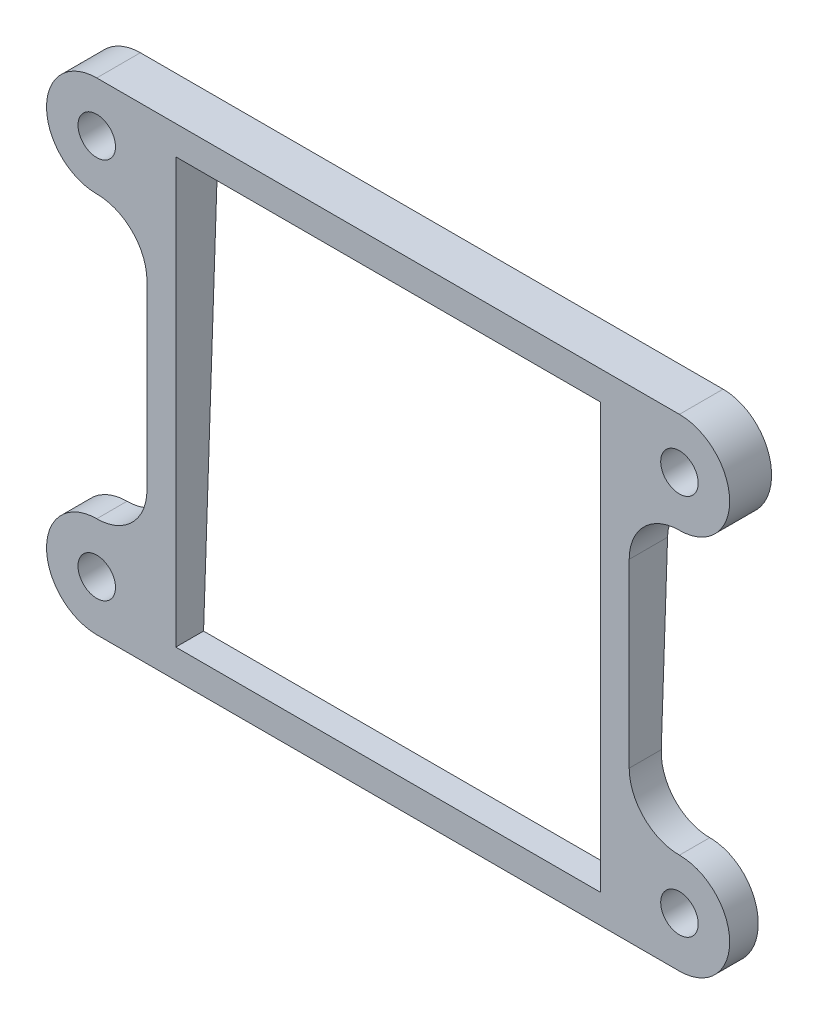
ISO-10303-21;
HEADER;
FILE_DESCRIPTION(('STEP AP214'),'2;1');
FILE_NAME('part.step','',(''),(''),'','','');
FILE_SCHEMA(('AUTOMOTIVE_DESIGN { 1 0 10303 214 1 1 1 1 }'));
ENDSEC;
DATA;
#1=APPLICATION_CONTEXT('core data for automotive mechanical design processes');
#2=APPLICATION_PROTOCOL_DEFINITION('international standard','automotive_design',2000,#1);
#3=PRODUCT_CONTEXT('',#1,'mechanical');
#4=PRODUCT('Part','Part','',(#3));
#5=PRODUCT_RELATED_PRODUCT_CATEGORY('part','',(#4));
#6=PRODUCT_DEFINITION_FORMATION('','',#4);
#7=PRODUCT_DEFINITION_CONTEXT('part definition',#1,'design');
#8=PRODUCT_DEFINITION('design','',#6,#7);
#9=PRODUCT_DEFINITION_SHAPE('','',#8);
#10=(LENGTH_UNIT() NAMED_UNIT(*) SI_UNIT(.MILLI.,.METRE.));
#11=(NAMED_UNIT(*) PLANE_ANGLE_UNIT() SI_UNIT($,.RADIAN.));
#12=(NAMED_UNIT(*) SI_UNIT($,.STERADIAN.) SOLID_ANGLE_UNIT());
#13=UNCERTAINTY_MEASURE_WITH_UNIT(LENGTH_MEASURE(1.E-05),#10,'distance_accuracy_value','');
#14=(GEOMETRIC_REPRESENTATION_CONTEXT(3) GLOBAL_UNCERTAINTY_ASSIGNED_CONTEXT((#13)) GLOBAL_UNIT_ASSIGNED_CONTEXT((#10,
#11,#12)) REPRESENTATION_CONTEXT('',''));
#15=CARTESIAN_POINT('',(0.,0.,0.));
#16=DIRECTION('',(0.,0.,1.));
#17=DIRECTION('',(1.,0.,0.));
#18=AXIS2_PLACEMENT_3D('',#15,#16,#17);
#19=CARTESIAN_POINT('',(76.2,45.72,-3.19315516232476));
#20=DIRECTION('',(0.,0.0348994967024938,0.999390827019096));
#21=DIRECTION('',(0.,-0.999390827019096,0.0348994967024938));
#22=AXIS2_PLACEMENT_3D('',#19,#20,#21);
#23=PLANE('',#22);
#24=CARTESIAN_POINT('',(55.245,36.195,-2.86053483291593));
#25=DIRECTION('',(0.,0.0348994967024938,0.999390827019096));
#26=DIRECTION('',(0.,-0.999390827019096,0.0348994967024938));
#27=AXIS2_PLACEMENT_3D('',#24,#25,#26);
#28=ELLIPSE('',#27,3.55816753952662,3.55600000000001);
#29=CARTESIAN_POINT('',(55.245,32.639,-2.7363565766033));
#30=VERTEX_POINT('',#29);
#31=EDGE_CURVE('E277',#30,#30,#28,.T.);
#32=ORIENTED_EDGE('',*,*,#31,.T.);
#33=EDGE_LOOP('',(#32));
#34=FACE_BOUND('',#33,.T.);
#35=CARTESIAN_POINT('',(55.245,-36.195,-0.332620329408829));
#36=DIRECTION('',(0.,0.0348994967024938,0.999390827019096));
#37=DIRECTION('',(0.,-0.999390827019096,0.0348994967024938));
#38=AXIS2_PLACEMENT_3D('',#35,#36,#37);
#39=ELLIPSE('',#38,3.55816753952662,3.55600000000001);
#40=CARTESIAN_POINT('',(55.245,-39.751,-0.208442073096199));
#41=VERTEX_POINT('',#40);
#42=EDGE_CURVE('E331',#41,#41,#39,.T.);
#43=ORIENTED_EDGE('',*,*,#42,.T.);
#44=EDGE_LOOP('',(#43));
#45=FACE_BOUND('',#44,.T.);
#46=CARTESIAN_POINT('',(-55.245,-36.195,-0.332620329408829));
#47=DIRECTION('',(0.,0.0348994967024938,0.999390827019096));
#48=DIRECTION('',(0.,-0.999390827019096,0.0348994967024938));
#49=AXIS2_PLACEMENT_3D('',#46,#47,#48);
#50=ELLIPSE('',#49,3.55816753952662,3.55600000000001);
#51=CARTESIAN_POINT('',(-55.245,-39.751,-0.208442073096199));
#52=VERTEX_POINT('',#51);
#53=EDGE_CURVE('E328',#52,#52,#50,.T.);
#54=ORIENTED_EDGE('',*,*,#53,.T.);
#55=EDGE_LOOP('',(#54));
#56=FACE_BOUND('',#55,.T.);
#57=CARTESIAN_POINT('',(-55.245,36.195,-2.86053483291593));
#58=DIRECTION('',(0.,0.0348994967024938,0.999390827019096));
#59=DIRECTION('',(0.,-0.999390827019096,0.0348994967024938));
#60=AXIS2_PLACEMENT_3D('',#57,#58,#59);
#61=ELLIPSE('',#60,3.55816753952662,3.55600000000001);
#62=CARTESIAN_POINT('',(-55.245,32.639,-2.7363565766033));
#63=VERTEX_POINT('',#62);
#64=EDGE_CURVE('E272',#63,#63,#61,.T.);
#65=ORIENTED_EDGE('',*,*,#64,.T.);
#66=EDGE_LOOP('',(#65));
#67=FACE_BOUND('',#66,.T.);
#68=CARTESIAN_POINT('',(55.245,-17.145,-0.997860988226486));
#69=DIRECTION('',(0.,0.0348994967024938,0.999390827019096));
#70=DIRECTION('',(0.,-0.999390827019096,0.0348994967024938));
#71=AXIS2_PLACEMENT_3D('',#68,#69,#70);
#72=ELLIPSE('',#71,9.53080590944628,9.525);
#73=CARTESIAN_POINT('',(45.72,-17.145,-0.997860988226486));
#74=VERTEX_POINT('',#73);
#75=CARTESIAN_POINT('',(55.245,-26.67,-0.665240658817657));
#76=VERTEX_POINT('',#75);
#77=EDGE_CURVE('E267',#74,#76,#72,.T.);
#78=ORIENTED_EDGE('',*,*,#77,.T.);
#79=CARTESIAN_POINT('',(55.245,-36.195,-0.332620329408829));
#80=DIRECTION('',(0.,0.0348994967024938,0.999390827019096));
#81=DIRECTION('',(0.,-0.999390827019096,0.0348994967024938));
#82=AXIS2_PLACEMENT_3D('',#79,#80,#81);
#83=ELLIPSE('',#82,9.53080590944628,9.525);
#84=CARTESIAN_POINT('',(55.245,-45.72,0.));
#85=VERTEX_POINT('',#84);
#86=EDGE_CURVE('E270',#76,#85,#83,.F.);
#87=ORIENTED_EDGE('',*,*,#86,.T.);
#88=DIRECTION('',(-1.,0.,0.));
#89=VECTOR('',#88,1.);
#90=CARTESIAN_POINT('',(45.72,-45.72,0.));
#91=LINE('',#90,#89);
#92=CARTESIAN_POINT('',(-55.245,-45.72,0.));
#93=VERTEX_POINT('',#92);
#94=EDGE_CURVE('E278',#85,#93,#91,.T.);
#95=ORIENTED_EDGE('',*,*,#94,.T.);
#96=CARTESIAN_POINT('',(-55.245,-36.195,-0.332620329408829));
#97=DIRECTION('',(0.,0.0348994967024938,0.999390827019096));
#98=DIRECTION('',(0.,-0.999390827019096,0.0348994967024938));
#99=AXIS2_PLACEMENT_3D('',#96,#97,#98);
#100=ELLIPSE('',#99,9.53080590944628,9.525);
#101=CARTESIAN_POINT('',(-55.245,-26.67,-0.665240658817657));
#102=VERTEX_POINT('',#101);
#103=EDGE_CURVE('E243',#93,#102,#100,.F.);
#104=ORIENTED_EDGE('',*,*,#103,.T.);
#105=CARTESIAN_POINT('',(-55.245,-17.145,-0.997860988226486));
#106=DIRECTION('',(0.,0.0348994967024938,0.999390827019096));
#107=DIRECTION('',(0.,-0.999390827019096,0.0348994967024938));
#108=AXIS2_PLACEMENT_3D('',#105,#106,#107);
#109=ELLIPSE('',#108,9.53080590944628,9.525);
#110=CARTESIAN_POINT('',(-45.72,-17.145,-0.997860988226486));
#111=VERTEX_POINT('',#110);
#112=EDGE_CURVE('E246',#102,#111,#109,.T.);
#113=ORIENTED_EDGE('',*,*,#112,.T.);
#114=DIRECTION('',(0.,0.999390827019096,-0.0348994967024938));
#115=VECTOR('',#114,1.);
#116=CARTESIAN_POINT('',(-45.72,45.72,-3.19315516232476));
#117=LINE('',#116,#115);
#118=CARTESIAN_POINT('',(-45.72,17.145,-2.19529417409827));
#119=VERTEX_POINT('',#118);
#120=EDGE_CURVE('E249',#111,#119,#117,.T.);
#121=ORIENTED_EDGE('',*,*,#120,.T.);
#122=CARTESIAN_POINT('',(-55.245,17.145,-2.19529417409827));
#123=DIRECTION('',(0.,0.0348994967024938,0.999390827019096));
#124=DIRECTION('',(0.,-0.999390827019096,0.0348994967024938));
#125=AXIS2_PLACEMENT_3D('',#122,#123,#124);
#126=ELLIPSE('',#125,9.53080590944628,9.525);
#127=CARTESIAN_POINT('',(-55.245,26.67,-2.5279145035071));
#128=VERTEX_POINT('',#127);
#129=EDGE_CURVE('E252',#119,#128,#126,.T.);
#130=ORIENTED_EDGE('',*,*,#129,.T.);
#131=CARTESIAN_POINT('',(-55.245,36.195,-2.86053483291593));
#132=DIRECTION('',(0.,0.0348994967024938,0.999390827019096));
#133=DIRECTION('',(0.,-0.999390827019096,0.0348994967024938));
#134=AXIS2_PLACEMENT_3D('',#131,#132,#133);
#135=ELLIPSE('',#134,9.53080590944627,9.525);
#136=CARTESIAN_POINT('',(-55.245,45.72,-3.19315516232476));
#137=VERTEX_POINT('',#136);
#138=EDGE_CURVE('E255',#128,#137,#135,.F.);
#139=ORIENTED_EDGE('',*,*,#138,.T.);
#140=DIRECTION('',(-1.,0.,0.));
#141=VECTOR('',#140,1.);
#142=CARTESIAN_POINT('',(76.2,45.72,-3.19315516232476));
#143=LINE('',#142,#141);
#144=CARTESIAN_POINT('',(55.245,45.72,-3.19315516232476));
#145=VERTEX_POINT('',#144);
#146=EDGE_CURVE('E273',#145,#137,#143,.T.);
#147=ORIENTED_EDGE('',*,*,#146,.F.);
#148=CARTESIAN_POINT('',(55.245,36.195,-2.86053483291593));
#149=DIRECTION('',(0.,0.0348994967024938,0.999390827019096));
#150=DIRECTION('',(0.,-0.999390827019096,0.0348994967024938));
#151=AXIS2_PLACEMENT_3D('',#148,#149,#150);
#152=ELLIPSE('',#151,9.53080590944628,9.525);
#153=CARTESIAN_POINT('',(55.245,26.67,-2.5279145035071));
#154=VERTEX_POINT('',#153);
#155=EDGE_CURVE('E258',#145,#154,#152,.F.);
#156=ORIENTED_EDGE('',*,*,#155,.T.);
#157=CARTESIAN_POINT('',(55.245,17.145,-2.19529417409827));
#158=DIRECTION('',(0.,0.0348994967024938,0.999390827019096));
#159=DIRECTION('',(0.,-0.999390827019096,0.0348994967024938));
#160=AXIS2_PLACEMENT_3D('',#157,#158,#159);
#161=ELLIPSE('',#160,9.53080590944628,9.525);
#162=CARTESIAN_POINT('',(45.72,17.145,-2.19529417409827));
#163=VERTEX_POINT('',#162);
#164=EDGE_CURVE('E261',#154,#163,#161,.T.);
#165=ORIENTED_EDGE('',*,*,#164,.T.);
#166=DIRECTION('',(0.,-0.999390827019096,0.0348994967024938));
#167=VECTOR('',#166,1.);
#168=CARTESIAN_POINT('',(45.72,45.72,-3.19315516232476));
#169=LINE('',#168,#167);
#170=EDGE_CURVE('E264',#163,#74,#169,.T.);
#171=ORIENTED_EDGE('',*,*,#170,.T.);
#172=EDGE_LOOP('',(#78,#87,#95,#104,#113,#121,#130,#139,#147,#156,#165,#171));
#173=FACE_BOUND('',#172,.T.);
#174=DIRECTION('',(0.,-0.999390827019096,0.0348994967024938));
#175=VECTOR('',#174,1.);
#176=CARTESIAN_POINT('',(-40.259,45.72,-3.19315516232476));
#177=LINE('',#176,#175);
#178=CARTESIAN_POINT('',(-40.259,40.259,-3.00245284013036));
#179=VERTEX_POINT('',#178);
#180=CARTESIAN_POINT('',(-40.259,-40.259,-0.190702322194394));
#181=VERTEX_POINT('',#180);
#182=EDGE_CURVE('E321',#179,#181,#177,.T.);
#183=ORIENTED_EDGE('',*,*,#182,.T.);
#184=DIRECTION('',(1.,0.,0.));
#185=VECTOR('',#184,1.);
#186=CARTESIAN_POINT('',(76.2,-40.259,-0.190702322194395));
#187=LINE('',#186,#185);
#188=CARTESIAN_POINT('',(40.259,-40.259,-0.190702322194395));
#189=VERTEX_POINT('',#188);
#190=EDGE_CURVE('E190',#181,#189,#187,.T.);
#191=ORIENTED_EDGE('',*,*,#190,.T.);
#192=DIRECTION('',(0.,0.999390827019096,-0.0348994967024938));
#193=VECTOR('',#192,1.);
#194=CARTESIAN_POINT('',(40.259,45.72,-3.19315516232476));
#195=LINE('',#194,#193);
#196=CARTESIAN_POINT('',(40.259,40.259,-3.00245284013036));
#197=VERTEX_POINT('',#196);
#198=EDGE_CURVE('E40',#189,#197,#195,.T.);
#199=ORIENTED_EDGE('',*,*,#198,.T.);
#200=DIRECTION('',(-1.,0.,0.));
#201=VECTOR('',#200,1.);
#202=CARTESIAN_POINT('',(76.2,40.259,-3.00245284013036));
#203=LINE('',#202,#201);
#204=EDGE_CURVE('E310',#197,#179,#203,.T.);
#205=ORIENTED_EDGE('',*,*,#204,.T.);
#206=EDGE_LOOP('',(#183,#191,#199,#205));
#207=FACE_BOUND('',#206,.T.);
#208=ADVANCED_FACE('F32',(#34,#45,#56,#67,#173,#207),#23,.F.);
#209=CARTESIAN_POINT('',(-76.2,-45.72,5.08));
#210=DIRECTION('',(0.,0.,-1.));
#211=DIRECTION('',(-1.,0.,0.));
#212=AXIS2_PLACEMENT_3D('',#209,#210,#211);
#213=PLANE('',#212);
#214=CARTESIAN_POINT('',(-55.245,36.195,5.08));
#215=DIRECTION('',(0.,0.,-1.));
#216=DIRECTION('',(-1.,0.,0.));
#217=AXIS2_PLACEMENT_3D('',#214,#215,#216);
#218=CIRCLE('',#217,3.55600000000001);
#219=CARTESIAN_POINT('',(-58.801,36.195,5.08));
#220=VERTEX_POINT('',#219);
#221=EDGE_CURVE('E235',#220,#220,#218,.F.);
#222=ORIENTED_EDGE('',*,*,#221,.F.);
#223=EDGE_LOOP('',(#222));
#224=FACE_BOUND('',#223,.T.);
#225=CARTESIAN_POINT('',(-55.245,36.195,5.08));
#226=DIRECTION('',(0.,0.,-1.));
#227=DIRECTION('',(-1.,0.,0.));
#228=AXIS2_PLACEMENT_3D('',#225,#226,#227);
#229=CIRCLE('',#228,9.525);
#230=CARTESIAN_POINT('',(-55.245,45.72,5.08));
#231=VERTEX_POINT('',#230);
#232=CARTESIAN_POINT('',(-64.77,36.195,5.08));
#233=VERTEX_POINT('',#232);
#234=EDGE_CURVE('E234',#231,#233,#229,.F.);
#235=ORIENTED_EDGE('',*,*,#234,.T.);
#236=CARTESIAN_POINT('',(-55.245,26.67,5.08));
#237=VERTEX_POINT('',#236);
#238=EDGE_CURVE('E232',#233,#237,#229,.F.);
#239=ORIENTED_EDGE('',*,*,#238,.T.);
#240=CARTESIAN_POINT('',(-55.245,17.145,5.08));
#241=DIRECTION('',(0.,0.,-1.));
#242=DIRECTION('',(-1.,0.,0.));
#243=AXIS2_PLACEMENT_3D('',#240,#241,#242);
#244=CIRCLE('',#243,9.525);
#245=CARTESIAN_POINT('',(-45.72,17.145,5.08));
#246=VERTEX_POINT('',#245);
#247=EDGE_CURVE('E229',#246,#237,#244,.F.);
#248=ORIENTED_EDGE('',*,*,#247,.F.);
#249=DIRECTION('',(0.,-1.,0.));
#250=VECTOR('',#249,1.);
#251=CARTESIAN_POINT('',(-45.72,-45.72,5.08));
#252=LINE('',#251,#250);
#253=CARTESIAN_POINT('',(-45.72,-17.145,5.08));
#254=VERTEX_POINT('',#253);
#255=EDGE_CURVE('E227',#246,#254,#252,.T.);
#256=ORIENTED_EDGE('',*,*,#255,.T.);
#257=CARTESIAN_POINT('',(-55.245,-17.145,5.08));
#258=DIRECTION('',(0.,0.,-1.));
#259=DIRECTION('',(-1.,0.,0.));
#260=AXIS2_PLACEMENT_3D('',#257,#258,#259);
#261=CIRCLE('',#260,9.525);
#262=CARTESIAN_POINT('',(-55.245,-26.67,5.08));
#263=VERTEX_POINT('',#262);
#264=EDGE_CURVE('E221',#263,#254,#261,.F.);
#265=ORIENTED_EDGE('',*,*,#264,.F.);
#266=CARTESIAN_POINT('',(-55.245,-36.195,5.08));
#267=DIRECTION('',(0.,0.,-1.));
#268=DIRECTION('',(-1.,0.,0.));
#269=AXIS2_PLACEMENT_3D('',#266,#267,#268);
#270=CIRCLE('',#269,9.525);
#271=CARTESIAN_POINT('',(-64.77,-36.195,5.08));
#272=VERTEX_POINT('',#271);
#273=EDGE_CURVE('E224',#263,#272,#270,.F.);
#274=ORIENTED_EDGE('',*,*,#273,.T.);
#275=CARTESIAN_POINT('',(-55.245,-45.72,5.08));
#276=VERTEX_POINT('',#275);
#277=EDGE_CURVE('E226',#272,#276,#270,.F.);
#278=ORIENTED_EDGE('',*,*,#277,.T.);
#279=DIRECTION('',(1.,0.,0.));
#280=VECTOR('',#279,1.);
#281=CARTESIAN_POINT('',(-76.2,-45.72,5.08));
#282=LINE('',#281,#280);
#283=CARTESIAN_POINT('',(55.2449999999999,-45.72,5.08));
#284=VERTEX_POINT('',#283);
#285=EDGE_CURVE('E200',#276,#284,#282,.T.);
#286=ORIENTED_EDGE('',*,*,#285,.T.);
#287=CARTESIAN_POINT('',(55.245,-36.195,5.08));
#288=DIRECTION('',(0.,0.,-1.));
#289=DIRECTION('',(-1.,0.,0.));
#290=AXIS2_PLACEMENT_3D('',#287,#288,#289);
#291=CIRCLE('',#290,9.525);
#292=CARTESIAN_POINT('',(64.77,-36.195,5.08));
#293=VERTEX_POINT('',#292);
#294=EDGE_CURVE('E214',#284,#293,#291,.F.);
#295=ORIENTED_EDGE('',*,*,#294,.T.);
#296=CARTESIAN_POINT('',(55.245,-26.67,5.08));
#297=VERTEX_POINT('',#296);
#298=EDGE_CURVE('E212',#293,#297,#291,.F.);
#299=ORIENTED_EDGE('',*,*,#298,.T.);
#300=CARTESIAN_POINT('',(55.245,-17.145,5.08));
#301=DIRECTION('',(0.,0.,-1.));
#302=DIRECTION('',(-1.,0.,0.));
#303=AXIS2_PLACEMENT_3D('',#300,#301,#302);
#304=CIRCLE('',#303,9.525);
#305=CARTESIAN_POINT('',(45.72,-17.145,5.08));
#306=VERTEX_POINT('',#305);
#307=EDGE_CURVE('E209',#306,#297,#304,.F.);
#308=ORIENTED_EDGE('',*,*,#307,.F.);
#309=DIRECTION('',(0.,1.,0.));
#310=VECTOR('',#309,1.);
#311=CARTESIAN_POINT('',(45.72,45.72,5.08));
#312=LINE('',#311,#310);
#313=CARTESIAN_POINT('',(45.72,17.145,5.08));
#314=VERTEX_POINT('',#313);
#315=EDGE_CURVE('E47',#306,#314,#312,.T.);
#316=ORIENTED_EDGE('',*,*,#315,.T.);
#317=CARTESIAN_POINT('',(55.245,17.145,5.08));
#318=DIRECTION('',(0.,0.,-1.));
#319=DIRECTION('',(-1.,0.,0.));
#320=AXIS2_PLACEMENT_3D('',#317,#318,#319);
#321=CIRCLE('',#320,9.525);
#322=CARTESIAN_POINT('',(55.245,26.67,5.08));
#323=VERTEX_POINT('',#322);
#324=EDGE_CURVE('E11',#323,#314,#321,.F.);
#325=ORIENTED_EDGE('',*,*,#324,.F.);
#326=CARTESIAN_POINT('',(55.245,36.195,5.08));
#327=DIRECTION('',(0.,0.,-1.));
#328=DIRECTION('',(-1.,0.,0.));
#329=AXIS2_PLACEMENT_3D('',#326,#327,#328);
#330=CIRCLE('',#329,9.525);
#331=CARTESIAN_POINT('',(64.77,36.195,5.08));
#332=VERTEX_POINT('',#331);
#333=EDGE_CURVE('E204',#323,#332,#330,.F.);
#334=ORIENTED_EDGE('',*,*,#333,.T.);
#335=CARTESIAN_POINT('',(55.245,45.72,5.08));
#336=VERTEX_POINT('',#335);
#337=EDGE_CURVE('E207',#332,#336,#330,.F.);
#338=ORIENTED_EDGE('',*,*,#337,.T.);
#339=DIRECTION('',(1.,0.,0.));
#340=VECTOR('',#339,1.);
#341=CARTESIAN_POINT('',(-76.2,45.72,5.08));
#342=LINE('',#341,#340);
#343=EDGE_CURVE('E201',#231,#336,#342,.T.);
#344=ORIENTED_EDGE('',*,*,#343,.F.);
#345=EDGE_LOOP('',(#235,#239,#248,#256,#265,#274,#278,#286,#295,#299,#308,#316,#325,#334,#338,#344));
#346=FACE_BOUND('',#345,.T.);
#347=CARTESIAN_POINT('',(55.245,-36.195,5.08));
#348=DIRECTION('',(0.,0.,-1.));
#349=DIRECTION('',(-1.,0.,0.));
#350=AXIS2_PLACEMENT_3D('',#347,#348,#349);
#351=CIRCLE('',#350,3.55600000000001);
#352=CARTESIAN_POINT('',(51.689,-36.195,5.08));
#353=VERTEX_POINT('',#352);
#354=EDGE_CURVE('E218',#353,#353,#351,.T.);
#355=ORIENTED_EDGE('',*,*,#354,.T.);
#356=EDGE_LOOP('',(#355));
#357=FACE_BOUND('',#356,.T.);
#358=CARTESIAN_POINT('',(55.245,36.195,5.08));
#359=DIRECTION('',(0.,0.,-1.));
#360=DIRECTION('',(-1.,0.,0.));
#361=AXIS2_PLACEMENT_3D('',#358,#359,#360);
#362=CIRCLE('',#361,3.55600000000001);
#363=CARTESIAN_POINT('',(51.689,36.195,5.08));
#364=VERTEX_POINT('',#363);
#365=EDGE_CURVE('E215',#364,#364,#362,.T.);
#366=ORIENTED_EDGE('',*,*,#365,.T.);
#367=EDGE_LOOP('',(#366));
#368=FACE_BOUND('',#367,.T.);
#369=CARTESIAN_POINT('',(-55.245,-36.195,5.08));
#370=DIRECTION('',(0.,0.,-1.));
#371=DIRECTION('',(-1.,0.,0.));
#372=AXIS2_PLACEMENT_3D('',#369,#370,#371);
#373=CIRCLE('',#372,3.55600000000001);
#374=CARTESIAN_POINT('',(-58.801,-36.195,5.08));
#375=VERTEX_POINT('',#374);
#376=EDGE_CURVE('E186',#375,#375,#373,.F.);
#377=ORIENTED_EDGE('',*,*,#376,.F.);
#378=EDGE_LOOP('',(#377));
#379=FACE_BOUND('',#378,.T.);
#380=DIRECTION('',(1.,0.,0.));
#381=VECTOR('',#380,1.);
#382=CARTESIAN_POINT('',(40.259,-40.259,5.08));
#383=LINE('',#382,#381);
#384=CARTESIAN_POINT('',(-40.259,-40.259,5.08));
#385=VERTEX_POINT('',#384);
#386=CARTESIAN_POINT('',(40.259,-40.259,5.08));
#387=VERTEX_POINT('',#386);
#388=EDGE_CURVE('E167',#385,#387,#383,.T.);
#389=ORIENTED_EDGE('',*,*,#388,.F.);
#390=DIRECTION('',(0.,-1.,0.));
#391=VECTOR('',#390,1.);
#392=CARTESIAN_POINT('',(-40.259,-40.259,5.08));
#393=LINE('',#392,#391);
#394=CARTESIAN_POINT('',(-40.259,40.259,5.08));
#395=VERTEX_POINT('',#394);
#396=EDGE_CURVE('E170',#395,#385,#393,.T.);
#397=ORIENTED_EDGE('',*,*,#396,.F.);
#398=DIRECTION('',(-1.,0.,0.));
#399=VECTOR('',#398,1.);
#400=CARTESIAN_POINT('',(-40.259,40.259,5.08));
#401=LINE('',#400,#399);
#402=CARTESIAN_POINT('',(40.259,40.259,5.08));
#403=VERTEX_POINT('',#402);
#404=EDGE_CURVE('E241',#403,#395,#401,.T.);
#405=ORIENTED_EDGE('',*,*,#404,.F.);
#406=DIRECTION('',(0.,1.,0.));
#407=VECTOR('',#406,1.);
#408=CARTESIAN_POINT('',(40.259,40.259,5.08));
#409=LINE('',#408,#407);
#410=EDGE_CURVE('E173',#387,#403,#409,.T.);
#411=ORIENTED_EDGE('',*,*,#410,.F.);
#412=EDGE_LOOP('',(#389,#397,#405,#411));
#413=FACE_BOUND('',#412,.T.);
#414=ADVANCED_FACE('F169',(#224,#346,#357,#368,#379,#413),#213,.F.);
#415=CARTESIAN_POINT('',(-45.72,45.72,40.64));
#416=DIRECTION('',(0.,1.,0.));
#417=DIRECTION('',(0.,0.,1.));
#418=AXIS2_PLACEMENT_3D('',#415,#416,#417);
#419=PLANE('',#418);
#420=ORIENTED_EDGE('',*,*,#343,.T.);
#421=DIRECTION('',(0.,0.,-1.));
#422=VECTOR('',#421,1.);
#423=CARTESIAN_POINT('',(55.245,45.72,0.));
#424=LINE('',#423,#422);
#425=EDGE_CURVE('E308',#336,#145,#424,.T.);
#426=ORIENTED_EDGE('',*,*,#425,.T.);
#427=ORIENTED_EDGE('',*,*,#146,.T.);
#428=DIRECTION('',(0.,0.,-1.));
#429=VECTOR('',#428,1.);
#430=CARTESIAN_POINT('',(-55.245,45.72,40.64));
#431=LINE('',#430,#429);
#432=EDGE_CURVE('E289',#137,#231,#431,.F.);
#433=ORIENTED_EDGE('',*,*,#432,.T.);
#434=EDGE_LOOP('',(#420,#426,#427,#433));
#435=FACE_BOUND('',#434,.T.);
#436=ADVANCED_FACE('F360',(#435),#419,.T.);
#437=CARTESIAN_POINT('',(-45.72,-45.72,40.64));
#438=DIRECTION('',(-1.,0.,0.));
#439=DIRECTION('',(0.,0.,1.));
#440=AXIS2_PLACEMENT_3D('',#437,#438,#439);
#441=PLANE('',#440);
#442=ORIENTED_EDGE('',*,*,#255,.F.);
#443=DIRECTION('',(0.,0.,-1.));
#444=VECTOR('',#443,1.);
#445=CARTESIAN_POINT('',(-45.72,17.145,0.));
#446=LINE('',#445,#444);
#447=EDGE_CURVE('E285',#246,#119,#446,.T.);
#448=ORIENTED_EDGE('',*,*,#447,.T.);
#449=ORIENTED_EDGE('',*,*,#120,.F.);
#450=DIRECTION('',(0.,0.,-1.));
#451=VECTOR('',#450,1.);
#452=CARTESIAN_POINT('',(-45.72,-17.145,6.35));
#453=LINE('',#452,#451);
#454=EDGE_CURVE('E281',#111,#254,#453,.F.);
#455=ORIENTED_EDGE('',*,*,#454,.T.);
#456=EDGE_LOOP('',(#442,#448,#449,#455));
#457=FACE_BOUND('',#456,.T.);
#458=ADVANCED_FACE('F366',(#457),#441,.T.);
#459=CARTESIAN_POINT('',(45.72,-45.72,40.64));
#460=DIRECTION('',(0.,-1.,0.));
#461=DIRECTION('',(0.,0.,-1.));
#462=AXIS2_PLACEMENT_3D('',#459,#460,#461);
#463=PLANE('',#462);
#464=ORIENTED_EDGE('',*,*,#285,.F.);
#465=DIRECTION('',(0.,0.,-1.));
#466=VECTOR('',#465,1.);
#467=CARTESIAN_POINT('',(-55.245,-45.72,40.64));
#468=LINE('',#467,#466);
#469=EDGE_CURVE('E287',#276,#93,#468,.T.);
#470=ORIENTED_EDGE('',*,*,#469,.T.);
#471=ORIENTED_EDGE('',*,*,#94,.F.);
#472=DIRECTION('',(0.,0.,-1.));
#473=VECTOR('',#472,1.);
#474=CARTESIAN_POINT('',(55.245,-45.72,6.35));
#475=LINE('',#474,#473);
#476=EDGE_CURVE('E305',#85,#284,#475,.F.);
#477=ORIENTED_EDGE('',*,*,#476,.T.);
#478=EDGE_LOOP('',(#464,#470,#471,#477));
#479=FACE_BOUND('',#478,.T.);
#480=ADVANCED_FACE('F408',(#479),#463,.T.);
#481=CARTESIAN_POINT('',(45.72,45.72,40.64));
#482=DIRECTION('',(1.,0.,0.));
#483=DIRECTION('',(0.,0.,-1.));
#484=AXIS2_PLACEMENT_3D('',#481,#482,#483);
#485=PLANE('',#484);
#486=ORIENTED_EDGE('',*,*,#315,.F.);
#487=DIRECTION('',(0.,0.,-1.));
#488=VECTOR('',#487,1.);
#489=CARTESIAN_POINT('',(45.72,-17.145,40.64));
#490=LINE('',#489,#488);
#491=EDGE_CURVE('E303',#306,#74,#490,.T.);
#492=ORIENTED_EDGE('',*,*,#491,.T.);
#493=ORIENTED_EDGE('',*,*,#170,.F.);
#494=DIRECTION('',(0.,0.,-1.));
#495=VECTOR('',#494,1.);
#496=CARTESIAN_POINT('',(45.72,17.145,40.64));
#497=LINE('',#496,#495);
#498=EDGE_CURVE('E292',#163,#314,#497,.F.);
#499=ORIENTED_EDGE('',*,*,#498,.T.);
#500=EDGE_LOOP('',(#486,#492,#493,#499));
#501=FACE_BOUND('',#500,.T.);
#502=ADVANCED_FACE('F402',(#501),#485,.T.);
#503=CARTESIAN_POINT('',(-40.259,40.259,-101.042647615157));
#504=DIRECTION('',(0.,1.,0.));
#505=DIRECTION('',(0.,0.,1.));
#506=AXIS2_PLACEMENT_3D('',#503,#504,#505);
#507=PLANE('',#506);
#508=ORIENTED_EDGE('',*,*,#204,.F.);
#509=DIRECTION('',(0.,0.,1.));
#510=VECTOR('',#509,1.);
#511=CARTESIAN_POINT('',(40.259,40.259,-3.19315516232475));
#512=LINE('',#511,#510);
#513=EDGE_CURVE('E197',#197,#403,#512,.T.);
#514=ORIENTED_EDGE('',*,*,#513,.T.);
#515=ORIENTED_EDGE('',*,*,#404,.T.);
#516=DIRECTION('',(0.,0.,1.));
#517=VECTOR('',#516,1.);
#518=CARTESIAN_POINT('',(-40.259,40.259,-3.19315516232475));
#519=LINE('',#518,#517);
#520=EDGE_CURVE('E185',#179,#395,#519,.T.);
#521=ORIENTED_EDGE('',*,*,#520,.F.);
#522=EDGE_LOOP('',(#508,#514,#515,#521));
#523=FACE_BOUND('',#522,.T.);
#524=ADVANCED_FACE('F392',(#523),#507,.F.);
#525=CARTESIAN_POINT('',(40.259,40.259,-101.042647615157));
#526=DIRECTION('',(1.,0.,0.));
#527=DIRECTION('',(0.,0.,-1.));
#528=AXIS2_PLACEMENT_3D('',#525,#526,#527);
#529=PLANE('',#528);
#530=ORIENTED_EDGE('',*,*,#198,.F.);
#531=DIRECTION('',(0.,0.,1.));
#532=VECTOR('',#531,1.);
#533=CARTESIAN_POINT('',(40.259,-40.259,-3.19315516232475));
#534=LINE('',#533,#532);
#535=EDGE_CURVE('E192',#189,#387,#534,.T.);
#536=ORIENTED_EDGE('',*,*,#535,.T.);
#537=ORIENTED_EDGE('',*,*,#410,.T.);
#538=ORIENTED_EDGE('',*,*,#513,.F.);
#539=EDGE_LOOP('',(#530,#536,#537,#538));
#540=FACE_BOUND('',#539,.T.);
#541=ADVANCED_FACE('F394',(#540),#529,.F.);
#542=CARTESIAN_POINT('',(40.259,-40.259,-101.042647615157));
#543=DIRECTION('',(0.,-1.,0.));
#544=DIRECTION('',(0.,0.,-1.));
#545=AXIS2_PLACEMENT_3D('',#542,#543,#544);
#546=PLANE('',#545);
#547=ORIENTED_EDGE('',*,*,#190,.F.);
#548=DIRECTION('',(0.,0.,1.));
#549=VECTOR('',#548,1.);
#550=CARTESIAN_POINT('',(-40.259,-40.259,-3.19315516232475));
#551=LINE('',#550,#549);
#552=EDGE_CURVE('E183',#181,#385,#551,.T.);
#553=ORIENTED_EDGE('',*,*,#552,.T.);
#554=ORIENTED_EDGE('',*,*,#388,.T.);
#555=ORIENTED_EDGE('',*,*,#535,.F.);
#556=EDGE_LOOP('',(#547,#553,#554,#555));
#557=FACE_BOUND('',#556,.T.);
#558=ADVANCED_FACE('F188',(#557),#546,.F.);
#559=CARTESIAN_POINT('',(-40.259,-40.259,-101.042647615157));
#560=DIRECTION('',(-1.,0.,0.));
#561=DIRECTION('',(0.,0.,1.));
#562=AXIS2_PLACEMENT_3D('',#559,#560,#561);
#563=PLANE('',#562);
#564=ORIENTED_EDGE('',*,*,#182,.F.);
#565=ORIENTED_EDGE('',*,*,#520,.T.);
#566=ORIENTED_EDGE('',*,*,#396,.T.);
#567=ORIENTED_EDGE('',*,*,#552,.F.);
#568=EDGE_LOOP('',(#564,#565,#566,#567));
#569=FACE_BOUND('',#568,.T.);
#570=ADVANCED_FACE('F182',(#569),#563,.F.);
#571=CARTESIAN_POINT('',(-55.245,-36.195,6.35));
#572=DIRECTION('',(0.,0.,-1.));
#573=DIRECTION('',(-1.,0.,0.));
#574=AXIS2_PLACEMENT_3D('',#571,#572,#573);
#575=CYLINDRICAL_SURFACE('',#574,3.55600000000001);
#576=ORIENTED_EDGE('',*,*,#376,.T.);
#577=EDGE_LOOP('',(#576));
#578=FACE_BOUND('',#577,.T.);
#579=ORIENTED_EDGE('',*,*,#53,.F.);
#580=EDGE_LOOP('',(#579));
#581=FACE_BOUND('',#580,.T.);
#582=ADVANCED_FACE('F378',(#578,#581),#575,.F.);
#583=CARTESIAN_POINT('',(-55.245,36.195,6.35));
#584=DIRECTION('',(0.,0.,-1.));
#585=DIRECTION('',(-1.,0.,0.));
#586=AXIS2_PLACEMENT_3D('',#583,#584,#585);
#587=CYLINDRICAL_SURFACE('',#586,3.55600000000001);
#588=ORIENTED_EDGE('',*,*,#221,.T.);
#589=EDGE_LOOP('',(#588));
#590=FACE_BOUND('',#589,.T.);
#591=ORIENTED_EDGE('',*,*,#64,.F.);
#592=EDGE_LOOP('',(#591));
#593=FACE_BOUND('',#592,.T.);
#594=ADVANCED_FACE('F381',(#590,#593),#587,.F.);
#595=CARTESIAN_POINT('',(-55.245,36.195,6.35));
#596=DIRECTION('',(0.,0.,-1.));
#597=DIRECTION('',(-1.,0.,0.));
#598=AXIS2_PLACEMENT_3D('',#595,#596,#597);
#599=CYLINDRICAL_SURFACE('',#598,9.525);
#600=ORIENTED_EDGE('',*,*,#238,.F.);
#601=DIRECTION('',(0.,0.,-1.));
#602=VECTOR('',#601,1.);
#603=CARTESIAN_POINT('',(-64.77,36.195,6.35));
#604=LINE('',#603,#602);
#605=CARTESIAN_POINT('',(-64.77,36.195,0.));
#606=VERTEX_POINT('',#605);
#607=EDGE_CURVE('E282',#233,#606,#604,.T.);
#608=ORIENTED_EDGE('',*,*,#607,.T.);
#609=ORIENTED_EDGE('',*,*,#607,.F.);
#610=ORIENTED_EDGE('',*,*,#234,.F.);
#611=ORIENTED_EDGE('',*,*,#432,.F.);
#612=ORIENTED_EDGE('',*,*,#138,.F.);
#613=DIRECTION('',(0.,0.,-1.));
#614=VECTOR('',#613,1.);
#615=CARTESIAN_POINT('',(-55.245,26.67,6.35));
#616=LINE('',#615,#614);
#617=EDGE_CURVE('E293',#237,#128,#616,.T.);
#618=ORIENTED_EDGE('',*,*,#617,.F.);
#619=EDGE_LOOP('',(#600,#608,#609,#610,#611,#612,#618));
#620=FACE_BOUND('',#619,.T.);
#621=ADVANCED_FACE('F420',(#620),#599,.T.);
#622=CARTESIAN_POINT('',(-55.245,17.145,40.64));
#623=DIRECTION('',(0.,0.,1.));
#624=DIRECTION('',(1.,0.,0.));
#625=AXIS2_PLACEMENT_3D('',#622,#623,#624);
#626=CYLINDRICAL_SURFACE('',#625,9.525);
#627=ORIENTED_EDGE('',*,*,#447,.F.);
#628=ORIENTED_EDGE('',*,*,#247,.T.);
#629=ORIENTED_EDGE('',*,*,#617,.T.);
#630=ORIENTED_EDGE('',*,*,#129,.F.);
#631=EDGE_LOOP('',(#627,#628,#629,#630));
#632=FACE_BOUND('',#631,.T.);
#633=ADVANCED_FACE('F416',(#632),#626,.F.);
#634=CARTESIAN_POINT('',(-55.245,-36.195,40.64));
#635=DIRECTION('',(0.,0.,-1.));
#636=DIRECTION('',(-1.,0.,0.));
#637=AXIS2_PLACEMENT_3D('',#634,#635,#636);
#638=CYLINDRICAL_SURFACE('',#637,9.525);
#639=ORIENTED_EDGE('',*,*,#277,.F.);
#640=DIRECTION('',(0.,0.,-1.));
#641=VECTOR('',#640,1.);
#642=CARTESIAN_POINT('',(-64.77,-36.195,6.35));
#643=LINE('',#642,#641);
#644=CARTESIAN_POINT('',(-64.77,-36.195,0.));
#645=VERTEX_POINT('',#644);
#646=EDGE_CURVE('E53',#645,#272,#643,.F.);
#647=ORIENTED_EDGE('',*,*,#646,.F.);
#648=ORIENTED_EDGE('',*,*,#646,.T.);
#649=ORIENTED_EDGE('',*,*,#273,.F.);
#650=DIRECTION('',(0.,0.,-1.));
#651=VECTOR('',#650,1.);
#652=CARTESIAN_POINT('',(-55.245,-26.67,6.35));
#653=LINE('',#652,#651);
#654=EDGE_CURVE('E296',#102,#263,#653,.F.);
#655=ORIENTED_EDGE('',*,*,#654,.F.);
#656=ORIENTED_EDGE('',*,*,#103,.F.);
#657=ORIENTED_EDGE('',*,*,#469,.F.);
#658=EDGE_LOOP('',(#639,#647,#648,#649,#655,#656,#657));
#659=FACE_BOUND('',#658,.T.);
#660=ADVANCED_FACE('F419',(#659),#638,.T.);
#661=CARTESIAN_POINT('',(-55.245,-17.145,6.35));
#662=DIRECTION('',(0.,0.,1.));
#663=DIRECTION('',(1.,0.,0.));
#664=AXIS2_PLACEMENT_3D('',#661,#662,#663);
#665=CYLINDRICAL_SURFACE('',#664,9.525);
#666=ORIENTED_EDGE('',*,*,#654,.T.);
#667=ORIENTED_EDGE('',*,*,#264,.T.);
#668=ORIENTED_EDGE('',*,*,#454,.F.);
#669=ORIENTED_EDGE('',*,*,#112,.F.);
#670=EDGE_LOOP('',(#666,#667,#668,#669));
#671=FACE_BOUND('',#670,.T.);
#672=ADVANCED_FACE('F351',(#671),#665,.F.);
#673=CARTESIAN_POINT('',(55.245,-36.195,6.35));
#674=DIRECTION('',(0.,0.,-1.));
#675=DIRECTION('',(-1.,0.,0.));
#676=AXIS2_PLACEMENT_3D('',#673,#674,#675);
#677=CYLINDRICAL_SURFACE('',#676,3.55600000000001);
#678=ORIENTED_EDGE('',*,*,#354,.F.);
#679=EDGE_LOOP('',(#678));
#680=FACE_BOUND('',#679,.T.);
#681=ORIENTED_EDGE('',*,*,#42,.F.);
#682=EDGE_LOOP('',(#681));
#683=FACE_BOUND('',#682,.T.);
#684=ADVANCED_FACE('F341',(#680,#683),#677,.F.);
#685=CARTESIAN_POINT('',(55.245,36.195,6.35));
#686=DIRECTION('',(0.,0.,-1.));
#687=DIRECTION('',(-1.,0.,0.));
#688=AXIS2_PLACEMENT_3D('',#685,#686,#687);
#689=CYLINDRICAL_SURFACE('',#688,3.55600000000001);
#690=ORIENTED_EDGE('',*,*,#365,.F.);
#691=EDGE_LOOP('',(#690));
#692=FACE_BOUND('',#691,.T.);
#693=ORIENTED_EDGE('',*,*,#31,.F.);
#694=EDGE_LOOP('',(#693));
#695=FACE_BOUND('',#694,.T.);
#696=ADVANCED_FACE('F338',(#692,#695),#689,.F.);
#697=CARTESIAN_POINT('',(55.245,-36.195,6.35));
#698=DIRECTION('',(0.,0.,1.));
#699=DIRECTION('',(1.,0.,0.));
#700=AXIS2_PLACEMENT_3D('',#697,#698,#699);
#701=CYLINDRICAL_SURFACE('',#700,9.525);
#702=ORIENTED_EDGE('',*,*,#294,.F.);
#703=ORIENTED_EDGE('',*,*,#476,.F.);
#704=ORIENTED_EDGE('',*,*,#86,.F.);
#705=DIRECTION('',(0.,0.,-1.));
#706=VECTOR('',#705,1.);
#707=CARTESIAN_POINT('',(55.245,-26.67,6.35));
#708=LINE('',#707,#706);
#709=EDGE_CURVE('E311',#297,#76,#708,.T.);
#710=ORIENTED_EDGE('',*,*,#709,.F.);
#711=ORIENTED_EDGE('',*,*,#298,.F.);
#712=DIRECTION('',(0.,0.,-1.));
#713=VECTOR('',#712,1.);
#714=CARTESIAN_POINT('',(64.77,-36.195,0.));
#715=LINE('',#714,#713);
#716=CARTESIAN_POINT('',(64.77,-36.195,0.));
#717=VERTEX_POINT('',#716);
#718=EDGE_CURVE('E299',#293,#717,#715,.T.);
#719=ORIENTED_EDGE('',*,*,#718,.T.);
#720=ORIENTED_EDGE('',*,*,#718,.F.);
#721=EDGE_LOOP('',(#702,#703,#704,#710,#711,#719,#720));
#722=FACE_BOUND('',#721,.T.);
#723=ADVANCED_FACE('F340',(#722),#701,.T.);
#724=CARTESIAN_POINT('',(55.245,-17.145,40.64));
#725=DIRECTION('',(0.,0.,-1.));
#726=DIRECTION('',(-1.,0.,0.));
#727=AXIS2_PLACEMENT_3D('',#724,#725,#726);
#728=CYLINDRICAL_SURFACE('',#727,9.525);
#729=ORIENTED_EDGE('',*,*,#491,.F.);
#730=ORIENTED_EDGE('',*,*,#307,.T.);
#731=ORIENTED_EDGE('',*,*,#709,.T.);
#732=ORIENTED_EDGE('',*,*,#77,.F.);
#733=EDGE_LOOP('',(#729,#730,#731,#732));
#734=FACE_BOUND('',#733,.T.);
#735=ADVANCED_FACE('F348',(#734),#728,.F.);
#736=CARTESIAN_POINT('',(55.245,36.195,40.64));
#737=DIRECTION('',(0.,0.,1.));
#738=DIRECTION('',(1.,0.,0.));
#739=AXIS2_PLACEMENT_3D('',#736,#737,#738);
#740=CYLINDRICAL_SURFACE('',#739,9.525);
#741=ORIENTED_EDGE('',*,*,#333,.F.);
#742=DIRECTION('',(0.,0.,-1.));
#743=VECTOR('',#742,1.);
#744=CARTESIAN_POINT('',(55.245,26.67,6.35));
#745=LINE('',#744,#743);
#746=EDGE_CURVE('E276',#154,#323,#745,.F.);
#747=ORIENTED_EDGE('',*,*,#746,.F.);
#748=ORIENTED_EDGE('',*,*,#155,.F.);
#749=ORIENTED_EDGE('',*,*,#425,.F.);
#750=ORIENTED_EDGE('',*,*,#337,.F.);
#751=DIRECTION('',(0.,0.,-1.));
#752=VECTOR('',#751,1.);
#753=CARTESIAN_POINT('',(64.77,36.195,6.35));
#754=LINE('',#753,#752);
#755=CARTESIAN_POINT('',(64.77,36.195,0.));
#756=VERTEX_POINT('',#755);
#757=EDGE_CURVE('E313',#756,#332,#754,.F.);
#758=ORIENTED_EDGE('',*,*,#757,.F.);
#759=ORIENTED_EDGE('',*,*,#757,.T.);
#760=EDGE_LOOP('',(#741,#747,#748,#749,#750,#758,#759));
#761=FACE_BOUND('',#760,.T.);
#762=ADVANCED_FACE('F34',(#761),#740,.T.);
#763=CARTESIAN_POINT('',(55.245,17.145,6.35));
#764=DIRECTION('',(0.,0.,-1.));
#765=DIRECTION('',(-1.,0.,0.));
#766=AXIS2_PLACEMENT_3D('',#763,#764,#765);
#767=CYLINDRICAL_SURFACE('',#766,9.525);
#768=ORIENTED_EDGE('',*,*,#746,.T.);
#769=ORIENTED_EDGE('',*,*,#324,.T.);
#770=ORIENTED_EDGE('',*,*,#498,.F.);
#771=ORIENTED_EDGE('',*,*,#164,.F.);
#772=EDGE_LOOP('',(#768,#769,#770,#771));
#773=FACE_BOUND('',#772,.T.);
#774=ADVANCED_FACE('F432',(#773),#767,.F.);
#775=CLOSED_SHELL('',(#208,#414,#436,#458,#480,#502,#524,#541,#558,#570,#582,#594,#621,#633,
#660,#672,#684,#696,#723,#735,#762,#774));
#776=MANIFOLD_SOLID_BREP('B2',#775);
#777=ADVANCED_BREP_SHAPE_REPRESENTATION('',(#18,#776),#14);
#778=SHAPE_DEFINITION_REPRESENTATION(#9,#777);
ENDSEC;
END-ISO-10303-21;
